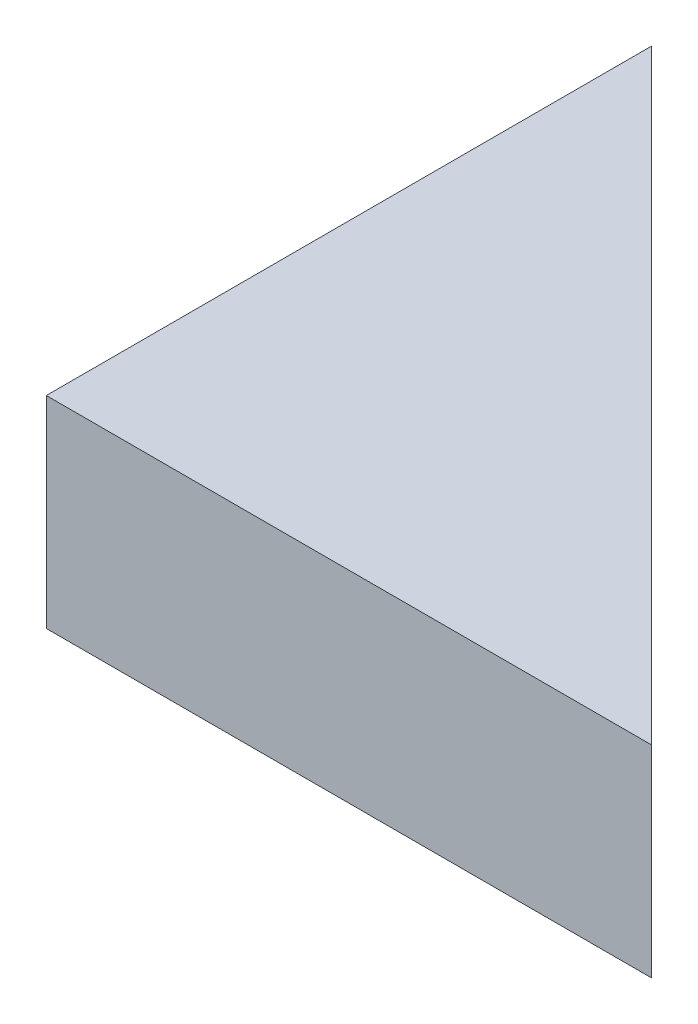
ISO-10303-21;
HEADER;
FILE_DESCRIPTION(('STEP AP214'),'2;1');
FILE_NAME('part.step','',(''),(''),'','','');
FILE_SCHEMA(('AUTOMOTIVE_DESIGN { 1 0 10303 214 1 1 1 1 }'));
ENDSEC;
DATA;
#1=APPLICATION_CONTEXT('core data for automotive mechanical design processes');
#2=APPLICATION_PROTOCOL_DEFINITION('international standard','automotive_design',2000,#1);
#3=PRODUCT_CONTEXT('',#1,'mechanical');
#4=PRODUCT('Part','Part','',(#3));
#5=PRODUCT_RELATED_PRODUCT_CATEGORY('part','',(#4));
#6=PRODUCT_DEFINITION_FORMATION('','',#4);
#7=PRODUCT_DEFINITION_CONTEXT('part definition',#1,'design');
#8=PRODUCT_DEFINITION('design','',#6,#7);
#9=PRODUCT_DEFINITION_SHAPE('','',#8);
#10=(LENGTH_UNIT() NAMED_UNIT(*) SI_UNIT(.MILLI.,.METRE.));
#11=(NAMED_UNIT(*) PLANE_ANGLE_UNIT() SI_UNIT($,.RADIAN.));
#12=(NAMED_UNIT(*) SI_UNIT($,.STERADIAN.) SOLID_ANGLE_UNIT());
#13=UNCERTAINTY_MEASURE_WITH_UNIT(LENGTH_MEASURE(1.E-05),#10,'distance_accuracy_value','');
#14=(GEOMETRIC_REPRESENTATION_CONTEXT(3) GLOBAL_UNCERTAINTY_ASSIGNED_CONTEXT((#13)) GLOBAL_UNIT_ASSIGNED_CONTEXT((#10,
#11,#12)) REPRESENTATION_CONTEXT('',''));
#15=CARTESIAN_POINT('',(0.,0.,0.));
#16=DIRECTION('',(0.,0.,1.));
#17=DIRECTION('',(1.,0.,0.));
#18=AXIS2_PLACEMENT_3D('',#15,#16,#17);
#19=CARTESIAN_POINT('',(19.2933864888502,-12.7,1031.10385266952));
#20=DIRECTION('',(0.707106781186548,0.,-0.707106781186548));
#21=DIRECTION('',(-0.707106781186548,0.,-0.707106781186548));
#22=AXIS2_PLACEMENT_3D('',#19,#20,#21);
#23=PLANE('',#22);
#24=DIRECTION('',(-0.707106781186547,0.,-0.707106781186547));
#25=VECTOR('',#24,1.);
#26=CARTESIAN_POINT('',(19.2933864888502,0.,1031.10385266952));
#27=LINE('',#26,#25);
#28=CARTESIAN_POINT('',(57.3933864888502,0.,1069.20385266952));
#29=VERTEX_POINT('',#28);
#30=CARTESIAN_POINT('',(19.2933864888502,0.,1031.10385266952));
#31=VERTEX_POINT('',#30);
#32=EDGE_CURVE('E85',#29,#31,#27,.T.);
#33=ORIENTED_EDGE('',*,*,#32,.F.);
#34=DIRECTION('',(0.,1.,0.));
#35=VECTOR('',#34,1.);
#36=CARTESIAN_POINT('',(57.3933864888502,-12.7,1069.20385266952));
#37=LINE('',#36,#35);
#38=CARTESIAN_POINT('',(57.3933864888502,-12.7,1069.20385266952));
#39=VERTEX_POINT('',#38);
#40=EDGE_CURVE('E11',#39,#29,#37,.T.);
#41=ORIENTED_EDGE('',*,*,#40,.F.);
#42=DIRECTION('',(-0.707106781186547,0.,-0.707106781186547));
#43=VECTOR('',#42,1.);
#44=CARTESIAN_POINT('',(19.2933864888502,-12.7,1031.10385266952));
#45=LINE('',#44,#43);
#46=CARTESIAN_POINT('',(19.2933864888502,-12.7,1031.10385266952));
#47=VERTEX_POINT('',#46);
#48=EDGE_CURVE('E77',#39,#47,#45,.T.);
#49=ORIENTED_EDGE('',*,*,#48,.T.);
#50=DIRECTION('',(0.,1.,0.));
#51=VECTOR('',#50,1.);
#52=CARTESIAN_POINT('',(19.2933864888502,-12.7,1031.10385266952));
#53=LINE('',#52,#51);
#54=EDGE_CURVE('E36',#47,#31,#53,.T.);
#55=ORIENTED_EDGE('',*,*,#54,.T.);
#56=EDGE_LOOP('',(#33,#41,#49,#55));
#57=FACE_BOUND('',#56,.T.);
#58=ADVANCED_FACE('F33',(#57),#23,.T.);
#59=CARTESIAN_POINT('',(57.3933864888502,-12.7,1069.20385266952));
#60=DIRECTION('',(0.,0.,1.));
#61=DIRECTION('',(1.,0.,0.));
#62=AXIS2_PLACEMENT_3D('',#59,#60,#61);
#63=PLANE('',#62);
#64=DIRECTION('',(1.,0.,0.));
#65=VECTOR('',#64,1.);
#66=CARTESIAN_POINT('',(57.3933864888502,0.,1069.20385266952));
#67=LINE('',#66,#65);
#68=CARTESIAN_POINT('',(19.2933864888502,0.,1069.20385266952));
#69=VERTEX_POINT('',#68);
#70=EDGE_CURVE('E79',#69,#29,#67,.T.);
#71=ORIENTED_EDGE('',*,*,#70,.F.);
#72=DIRECTION('',(0.,1.,0.));
#73=VECTOR('',#72,1.);
#74=CARTESIAN_POINT('',(19.2933864888502,-12.7,1069.20385266952));
#75=LINE('',#74,#73);
#76=CARTESIAN_POINT('',(19.2933864888502,-12.7,1069.20385266952));
#77=VERTEX_POINT('',#76);
#78=EDGE_CURVE('E42',#77,#69,#75,.T.);
#79=ORIENTED_EDGE('',*,*,#78,.F.);
#80=DIRECTION('',(1.,0.,0.));
#81=VECTOR('',#80,1.);
#82=CARTESIAN_POINT('',(57.3933864888502,-12.7,1069.20385266952));
#83=LINE('',#82,#81);
#84=EDGE_CURVE('E74',#77,#39,#83,.T.);
#85=ORIENTED_EDGE('',*,*,#84,.T.);
#86=ORIENTED_EDGE('',*,*,#40,.T.);
#87=EDGE_LOOP('',(#71,#79,#85,#86));
#88=FACE_BOUND('',#87,.T.);
#89=ADVANCED_FACE('F89',(#88),#63,.T.);
#90=CARTESIAN_POINT('',(19.2933864888502,-12.7,1069.20385266952));
#91=DIRECTION('',(-1.,0.,0.));
#92=DIRECTION('',(0.,0.,1.));
#93=AXIS2_PLACEMENT_3D('',#90,#91,#92);
#94=PLANE('',#93);
#95=DIRECTION('',(0.,0.,1.));
#96=VECTOR('',#95,1.);
#97=CARTESIAN_POINT('',(19.2933864888502,0.,1069.20385266952));
#98=LINE('',#97,#96);
#99=EDGE_CURVE('E72',#31,#69,#98,.T.);
#100=ORIENTED_EDGE('',*,*,#99,.F.);
#101=ORIENTED_EDGE('',*,*,#54,.F.);
#102=DIRECTION('',(0.,0.,1.));
#103=VECTOR('',#102,1.);
#104=CARTESIAN_POINT('',(19.2933864888502,-12.7,1069.20385266952));
#105=LINE('',#104,#103);
#106=EDGE_CURVE('E70',#47,#77,#105,.T.);
#107=ORIENTED_EDGE('',*,*,#106,.T.);
#108=ORIENTED_EDGE('',*,*,#78,.T.);
#109=EDGE_LOOP('',(#100,#101,#107,#108));
#110=FACE_BOUND('',#109,.T.);
#111=ADVANCED_FACE('F69',(#110),#94,.T.);
#112=CARTESIAN_POINT('',(0.,-12.7,0.));
#113=DIRECTION('',(0.,-1.,0.));
#114=DIRECTION('',(0.,0.,-1.));
#115=AXIS2_PLACEMENT_3D('',#112,#113,#114);
#116=PLANE('',#115);
#117=ORIENTED_EDGE('',*,*,#48,.F.);
#118=ORIENTED_EDGE('',*,*,#84,.F.);
#119=ORIENTED_EDGE('',*,*,#106,.F.);
#120=EDGE_LOOP('',(#117,#118,#119));
#121=FACE_BOUND('',#120,.T.);
#122=ADVANCED_FACE('F76',(#121),#116,.T.);
#123=CARTESIAN_POINT('',(0.,0.,0.));
#124=DIRECTION('',(0.,-1.,0.));
#125=DIRECTION('',(0.,0.,-1.));
#126=AXIS2_PLACEMENT_3D('',#123,#124,#125);
#127=PLANE('',#126);
#128=ORIENTED_EDGE('',*,*,#32,.T.);
#129=ORIENTED_EDGE('',*,*,#99,.T.);
#130=ORIENTED_EDGE('',*,*,#70,.T.);
#131=EDGE_LOOP('',(#128,#129,#130));
#132=FACE_BOUND('',#131,.T.);
#133=ADVANCED_FACE('F88',(#132),#127,.F.);
#134=CLOSED_SHELL('',(#58,#89,#111,#122,#133));
#135=MANIFOLD_SOLID_BREP('B2',#134);
#136=ADVANCED_BREP_SHAPE_REPRESENTATION('',(#18,#135),#14);
#137=SHAPE_DEFINITION_REPRESENTATION(#9,#136);
ENDSEC;
END-ISO-10303-21;
